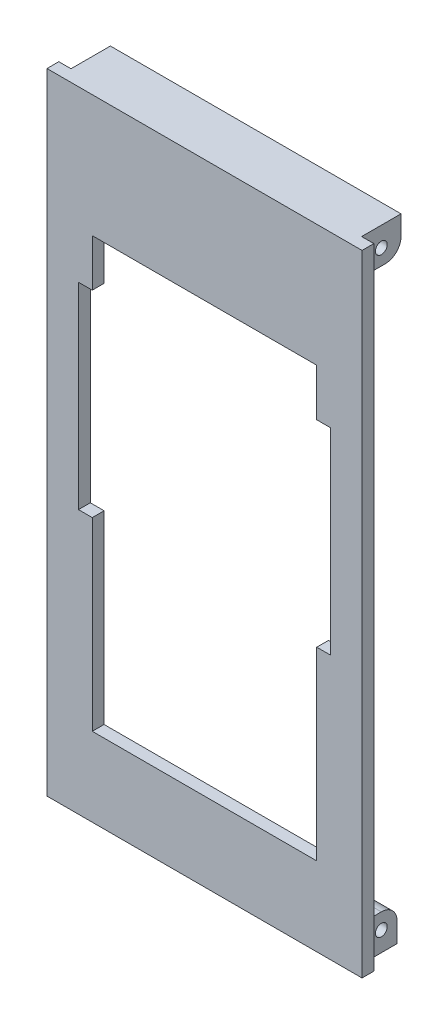
ISO-10303-21;
HEADER;
FILE_DESCRIPTION(('STEP AP214'),'2;1');
FILE_NAME('part.step','',(''),(''),'','','');
FILE_SCHEMA(('AUTOMOTIVE_DESIGN { 1 0 10303 214 1 1 1 1 }'));
ENDSEC;
DATA;
#1=APPLICATION_CONTEXT('core data for automotive mechanical design processes');
#2=APPLICATION_PROTOCOL_DEFINITION('international standard','automotive_design',2000,#1);
#3=PRODUCT_CONTEXT('',#1,'mechanical');
#4=PRODUCT('Part','Part','',(#3));
#5=PRODUCT_RELATED_PRODUCT_CATEGORY('part','',(#4));
#6=PRODUCT_DEFINITION_FORMATION('','',#4);
#7=PRODUCT_DEFINITION_CONTEXT('part definition',#1,'design');
#8=PRODUCT_DEFINITION('design','',#6,#7);
#9=PRODUCT_DEFINITION_SHAPE('','',#8);
#10=(LENGTH_UNIT() NAMED_UNIT(*) SI_UNIT(.MILLI.,.METRE.));
#11=(NAMED_UNIT(*) PLANE_ANGLE_UNIT() SI_UNIT($,.RADIAN.));
#12=(NAMED_UNIT(*) SI_UNIT($,.STERADIAN.) SOLID_ANGLE_UNIT());
#13=UNCERTAINTY_MEASURE_WITH_UNIT(LENGTH_MEASURE(1.E-05),#10,'distance_accuracy_value','');
#14=(GEOMETRIC_REPRESENTATION_CONTEXT(3) GLOBAL_UNCERTAINTY_ASSIGNED_CONTEXT((#13)) GLOBAL_UNIT_ASSIGNED_CONTEXT((#10,
#11,#12)) REPRESENTATION_CONTEXT('',''));
#15=CARTESIAN_POINT('',(0.,0.,0.));
#16=DIRECTION('',(0.,0.,1.));
#17=DIRECTION('',(1.,0.,0.));
#18=AXIS2_PLACEMENT_3D('',#15,#16,#17);
#19=CARTESIAN_POINT('',(0.,0.,0.));
#20=DIRECTION('',(1.,0.,0.));
#21=DIRECTION('',(0.,0.,-1.));
#22=AXIS2_PLACEMENT_3D('',#19,#20,#21);
#23=PLANE('',#22);
#24=DIRECTION('',(0.,1.,0.));
#25=VECTOR('',#24,1.);
#26=CARTESIAN_POINT('',(0.,9.,-3.));
#27=LINE('',#26,#25);
#28=CARTESIAN_POINT('',(0.,0.,-3.));
#29=VERTEX_POINT('',#28);
#30=CARTESIAN_POINT('',(0.,160.,-3.));
#31=VERTEX_POINT('',#30);
#32=EDGE_CURVE('E207',#29,#31,#27,.T.);
#33=ORIENTED_EDGE('',*,*,#32,.F.);
#34=DIRECTION('',(0.,0.,-1.));
#35=VECTOR('',#34,1.);
#36=CARTESIAN_POINT('',(0.,0.,0.));
#37=LINE('',#36,#35);
#38=CARTESIAN_POINT('',(0.,0.,0.));
#39=VERTEX_POINT('',#38);
#40=EDGE_CURVE('E221',#39,#29,#37,.T.);
#41=ORIENTED_EDGE('',*,*,#40,.F.);
#42=DIRECTION('',(0.,-1.,0.));
#43=VECTOR('',#42,1.);
#44=CARTESIAN_POINT('',(0.,0.,0.));
#45=LINE('',#44,#43);
#46=CARTESIAN_POINT('',(0.,160.,0.));
#47=VERTEX_POINT('',#46);
#48=EDGE_CURVE('E233',#47,#39,#45,.T.);
#49=ORIENTED_EDGE('',*,*,#48,.F.);
#50=DIRECTION('',(0.,0.,1.));
#51=VECTOR('',#50,1.);
#52=CARTESIAN_POINT('',(0.,160.,0.));
#53=LINE('',#52,#51);
#54=EDGE_CURVE('E220',#31,#47,#53,.T.);
#55=ORIENTED_EDGE('',*,*,#54,.F.);
#56=EDGE_LOOP('',(#33,#41,#49,#55));
#57=FACE_BOUND('',#56,.T.);
#58=ADVANCED_FACE('F35',(#57),#23,.F.);
#59=CARTESIAN_POINT('',(80.,0.,0.));
#60=DIRECTION('',(0.,1.,0.));
#61=DIRECTION('',(0.,0.,1.));
#62=AXIS2_PLACEMENT_3D('',#59,#60,#61);
#63=PLANE('',#62);
#64=DIRECTION('',(1.,0.,0.));
#65=VECTOR('',#64,1.);
#66=CARTESIAN_POINT('',(0.,0.,-3.));
#67=LINE('',#66,#65);
#68=CARTESIAN_POINT('',(3.1,0.,-3.));
#69=VERTEX_POINT('',#68);
#70=EDGE_CURVE('E215',#29,#69,#67,.T.);
#71=ORIENTED_EDGE('',*,*,#70,.T.);
#72=DIRECTION('',(0.,0.,1.));
#73=VECTOR('',#72,1.);
#74=CARTESIAN_POINT('',(3.1,0.,-15.));
#75=LINE('',#74,#73);
#76=CARTESIAN_POINT('',(3.1,0.,-12.));
#77=VERTEX_POINT('',#76);
#78=EDGE_CURVE('E463',#77,#69,#75,.T.);
#79=ORIENTED_EDGE('',*,*,#78,.F.);
#80=DIRECTION('',(-1.,0.,0.));
#81=VECTOR('',#80,1.);
#82=CARTESIAN_POINT('',(80.,0.,-12.));
#83=LINE('',#82,#81);
#84=CARTESIAN_POINT('',(76.9,0.,-12.));
#85=VERTEX_POINT('',#84);
#86=EDGE_CURVE('E253',#85,#77,#83,.T.);
#87=ORIENTED_EDGE('',*,*,#86,.F.);
#88=DIRECTION('',(0.,0.,1.));
#89=VECTOR('',#88,1.);
#90=CARTESIAN_POINT('',(76.9,0.,-15.));
#91=LINE('',#90,#89);
#92=CARTESIAN_POINT('',(76.9,0.,-3.));
#93=VERTEX_POINT('',#92);
#94=EDGE_CURVE('E421',#85,#93,#91,.T.);
#95=ORIENTED_EDGE('',*,*,#94,.T.);
#96=DIRECTION('',(-1.,0.,0.));
#97=VECTOR('',#96,1.);
#98=CARTESIAN_POINT('',(80.,0.,-3.));
#99=LINE('',#98,#97);
#100=CARTESIAN_POINT('',(80.,0.,-3.));
#101=VERTEX_POINT('',#100);
#102=EDGE_CURVE('E425',#101,#93,#99,.T.);
#103=ORIENTED_EDGE('',*,*,#102,.F.);
#104=DIRECTION('',(0.,0.,-1.));
#105=VECTOR('',#104,1.);
#106=CARTESIAN_POINT('',(80.,0.,0.));
#107=LINE('',#106,#105);
#108=CARTESIAN_POINT('',(80.,0.,0.));
#109=VERTEX_POINT('',#108);
#110=EDGE_CURVE('E235',#109,#101,#107,.T.);
#111=ORIENTED_EDGE('',*,*,#110,.F.);
#112=DIRECTION('',(-1.,0.,0.));
#113=VECTOR('',#112,1.);
#114=CARTESIAN_POINT('',(80.,0.,0.));
#115=LINE('',#114,#113);
#116=EDGE_CURVE('E239',#109,#39,#115,.T.);
#117=ORIENTED_EDGE('',*,*,#116,.T.);
#118=ORIENTED_EDGE('',*,*,#40,.T.);
#119=EDGE_LOOP('',(#71,#79,#87,#95,#103,#111,#117,#118));
#120=FACE_BOUND('',#119,.T.);
#121=ADVANCED_FACE('F402',(#120),#63,.F.);
#122=CARTESIAN_POINT('',(80.,0.,-12.));
#123=DIRECTION('',(0.,0.,1.));
#124=DIRECTION('',(1.,0.,0.));
#125=AXIS2_PLACEMENT_3D('',#122,#123,#124);
#126=PLANE('',#125);
#127=DIRECTION('',(0.,1.,0.));
#128=VECTOR('',#127,1.);
#129=CARTESIAN_POINT('',(3.10000000000001,0.,-12.));
#130=LINE('',#129,#128);
#131=CARTESIAN_POINT('',(3.10000000000001,5.,-12.));
#132=VERTEX_POINT('',#131);
#133=EDGE_CURVE('E290',#77,#132,#130,.T.);
#134=ORIENTED_EDGE('',*,*,#133,.T.);
#135=DIRECTION('',(-1.,0.,0.));
#136=VECTOR('',#135,1.);
#137=CARTESIAN_POINT('',(80.,5.,-12.));
#138=LINE('',#137,#136);
#139=CARTESIAN_POINT('',(76.9,5.,-12.));
#140=VERTEX_POINT('',#139);
#141=EDGE_CURVE('E43',#132,#140,#138,.F.);
#142=ORIENTED_EDGE('',*,*,#141,.T.);
#143=DIRECTION('',(0.,1.,0.));
#144=VECTOR('',#143,1.);
#145=CARTESIAN_POINT('',(76.9,0.,-12.));
#146=LINE('',#145,#144);
#147=EDGE_CURVE('E266',#85,#140,#146,.T.);
#148=ORIENTED_EDGE('',*,*,#147,.F.);
#149=ORIENTED_EDGE('',*,*,#86,.T.);
#150=EDGE_LOOP('',(#134,#142,#148,#149));
#151=FACE_BOUND('',#150,.T.);
#152=ADVANCED_FACE('F466',(#151),#126,.F.);
#153=CARTESIAN_POINT('',(80.,9.,-3.));
#154=DIRECTION('',(0.,-1.,0.));
#155=DIRECTION('',(0.,0.,-1.));
#156=AXIS2_PLACEMENT_3D('',#153,#154,#155);
#157=PLANE('',#156);
#158=DIRECTION('',(0.,0.,1.));
#159=VECTOR('',#158,1.);
#160=CARTESIAN_POINT('',(76.9,9.,-3.));
#161=LINE('',#160,#159);
#162=CARTESIAN_POINT('',(76.9,9.,-8.));
#163=VERTEX_POINT('',#162);
#164=CARTESIAN_POINT('',(76.9,9.,-3.));
#165=VERTEX_POINT('',#164);
#166=EDGE_CURVE('E285',#163,#165,#161,.T.);
#167=ORIENTED_EDGE('',*,*,#166,.F.);
#168=DIRECTION('',(-1.,0.,0.));
#169=VECTOR('',#168,1.);
#170=CARTESIAN_POINT('',(80.,9.,-8.));
#171=LINE('',#170,#169);
#172=CARTESIAN_POINT('',(3.1,9.,-8.));
#173=VERTEX_POINT('',#172);
#174=EDGE_CURVE('E275',#163,#173,#171,.T.);
#175=ORIENTED_EDGE('',*,*,#174,.T.);
#176=DIRECTION('',(0.,0.,1.));
#177=VECTOR('',#176,1.);
#178=CARTESIAN_POINT('',(3.10000000000001,9.,-2.99999999999999));
#179=LINE('',#178,#177);
#180=CARTESIAN_POINT('',(3.10000000000001,9.,-3.));
#181=VERTEX_POINT('',#180);
#182=EDGE_CURVE('E283',#173,#181,#179,.T.);
#183=ORIENTED_EDGE('',*,*,#182,.T.);
#184=DIRECTION('',(-1.,0.,0.));
#185=VECTOR('',#184,1.);
#186=CARTESIAN_POINT('',(80.,9.,-3.));
#187=LINE('',#186,#185);
#188=EDGE_CURVE('E250',#165,#181,#187,.T.);
#189=ORIENTED_EDGE('',*,*,#188,.F.);
#190=EDGE_LOOP('',(#167,#175,#183,#189));
#191=FACE_BOUND('',#190,.T.);
#192=ADVANCED_FACE('F281',(#191),#157,.F.);
#193=CARTESIAN_POINT('',(80.,151.,-3.));
#194=DIRECTION('',(0.,1.,0.));
#195=DIRECTION('',(0.,0.,1.));
#196=AXIS2_PLACEMENT_3D('',#193,#194,#195);
#197=PLANE('',#196);
#198=DIRECTION('',(0.,0.,-1.));
#199=VECTOR('',#198,1.);
#200=CARTESIAN_POINT('',(3.10000000000001,151.,-2.99999999999999));
#201=LINE('',#200,#199);
#202=CARTESIAN_POINT('',(3.1,151.,-3.));
#203=VERTEX_POINT('',#202);
#204=CARTESIAN_POINT('',(3.1,151.,-9.));
#205=VERTEX_POINT('',#204);
#206=EDGE_CURVE('E291',#203,#205,#201,.T.);
#207=ORIENTED_EDGE('',*,*,#206,.T.);
#208=DIRECTION('',(-1.,0.,0.));
#209=VECTOR('',#208,1.);
#210=CARTESIAN_POINT('',(80.,151.,-9.));
#211=LINE('',#210,#209);
#212=CARTESIAN_POINT('',(76.9,151.,-9.));
#213=VERTEX_POINT('',#212);
#214=EDGE_CURVE('E271',#205,#213,#211,.F.);
#215=ORIENTED_EDGE('',*,*,#214,.T.);
#216=DIRECTION('',(0.,0.,-1.));
#217=VECTOR('',#216,1.);
#218=CARTESIAN_POINT('',(76.9,151.,-3.));
#219=LINE('',#218,#217);
#220=CARTESIAN_POINT('',(76.9,151.,-3.));
#221=VERTEX_POINT('',#220);
#222=EDGE_CURVE('E434',#221,#213,#219,.T.);
#223=ORIENTED_EDGE('',*,*,#222,.F.);
#224=DIRECTION('',(-1.,0.,0.));
#225=VECTOR('',#224,1.);
#226=CARTESIAN_POINT('',(80.,151.,-3.));
#227=LINE('',#226,#225);
#228=EDGE_CURVE('E247',#221,#203,#227,.T.);
#229=ORIENTED_EDGE('',*,*,#228,.T.);
#230=EDGE_LOOP('',(#207,#215,#223,#229));
#231=FACE_BOUND('',#230,.T.);
#232=ADVANCED_FACE('F457',(#231),#197,.F.);
#233=CARTESIAN_POINT('',(80.,160.,-13.));
#234=DIRECTION('',(0.,0.,1.));
#235=DIRECTION('',(0.,-1.,0.));
#236=AXIS2_PLACEMENT_3D('',#233,#234,#235);
#237=PLANE('',#236);
#238=DIRECTION('',(0.,1.,0.));
#239=VECTOR('',#238,1.);
#240=CARTESIAN_POINT('',(76.9,160.,-13.));
#241=LINE('',#240,#239);
#242=CARTESIAN_POINT('',(76.9,155.,-13.));
#243=VERTEX_POINT('',#242);
#244=CARTESIAN_POINT('',(76.9,160.,-13.));
#245=VERTEX_POINT('',#244);
#246=EDGE_CURVE('E432',#243,#245,#241,.T.);
#247=ORIENTED_EDGE('',*,*,#246,.F.);
#248=DIRECTION('',(-1.,0.,0.));
#249=VECTOR('',#248,1.);
#250=CARTESIAN_POINT('',(80.,155.,-13.));
#251=LINE('',#250,#249);
#252=CARTESIAN_POINT('',(3.10000000000001,155.,-13.));
#253=VERTEX_POINT('',#252);
#254=EDGE_CURVE('E256',#243,#253,#251,.T.);
#255=ORIENTED_EDGE('',*,*,#254,.T.);
#256=DIRECTION('',(0.,1.,0.));
#257=VECTOR('',#256,1.);
#258=CARTESIAN_POINT('',(3.10000000000001,160.,-13.));
#259=LINE('',#258,#257);
#260=CARTESIAN_POINT('',(3.1,160.,-13.));
#261=VERTEX_POINT('',#260);
#262=EDGE_CURVE('E296',#253,#261,#259,.T.);
#263=ORIENTED_EDGE('',*,*,#262,.T.);
#264=DIRECTION('',(-1.,0.,0.));
#265=VECTOR('',#264,1.);
#266=CARTESIAN_POINT('',(80.,160.,-13.));
#267=LINE('',#266,#265);
#268=EDGE_CURVE('E245',#245,#261,#267,.T.);
#269=ORIENTED_EDGE('',*,*,#268,.F.);
#270=EDGE_LOOP('',(#247,#255,#263,#269));
#271=FACE_BOUND('',#270,.T.);
#272=ADVANCED_FACE('F444',(#271),#237,.F.);
#273=CARTESIAN_POINT('',(80.,160.,0.));
#274=DIRECTION('',(0.,-1.,0.));
#275=DIRECTION('',(0.,0.,-1.));
#276=AXIS2_PLACEMENT_3D('',#273,#274,#275);
#277=PLANE('',#276);
#278=DIRECTION('',(1.,0.,0.));
#279=VECTOR('',#278,1.);
#280=CARTESIAN_POINT('',(0.,160.,-3.));
#281=LINE('',#280,#279);
#282=CARTESIAN_POINT('',(3.1,160.,-3.));
#283=VERTEX_POINT('',#282);
#284=EDGE_CURVE('E212',#31,#283,#281,.T.);
#285=ORIENTED_EDGE('',*,*,#284,.F.);
#286=ORIENTED_EDGE('',*,*,#54,.T.);
#287=DIRECTION('',(-1.,0.,0.));
#288=VECTOR('',#287,1.);
#289=CARTESIAN_POINT('',(80.,160.,0.));
#290=LINE('',#289,#288);
#291=CARTESIAN_POINT('',(80.,160.,0.));
#292=VERTEX_POINT('',#291);
#293=EDGE_CURVE('E242',#292,#47,#290,.T.);
#294=ORIENTED_EDGE('',*,*,#293,.F.);
#295=DIRECTION('',(0.,0.,1.));
#296=VECTOR('',#295,1.);
#297=CARTESIAN_POINT('',(80.,160.,0.));
#298=LINE('',#297,#296);
#299=CARTESIAN_POINT('',(80.,160.,-3.));
#300=VERTEX_POINT('',#299);
#301=EDGE_CURVE('E399',#300,#292,#298,.T.);
#302=ORIENTED_EDGE('',*,*,#301,.F.);
#303=DIRECTION('',(-1.,0.,0.));
#304=VECTOR('',#303,1.);
#305=CARTESIAN_POINT('',(80.,160.,-3.));
#306=LINE('',#305,#304);
#307=CARTESIAN_POINT('',(76.9,160.,-3.));
#308=VERTEX_POINT('',#307);
#309=EDGE_CURVE('E414',#300,#308,#306,.T.);
#310=ORIENTED_EDGE('',*,*,#309,.T.);
#311=DIRECTION('',(0.,0.,1.));
#312=VECTOR('',#311,1.);
#313=CARTESIAN_POINT('',(76.9,160.,-15.));
#314=LINE('',#313,#312);
#315=EDGE_CURVE('E422',#245,#308,#314,.T.);
#316=ORIENTED_EDGE('',*,*,#315,.F.);
#317=ORIENTED_EDGE('',*,*,#268,.T.);
#318=DIRECTION('',(0.,0.,1.));
#319=VECTOR('',#318,1.);
#320=CARTESIAN_POINT('',(3.1,160.,-15.));
#321=LINE('',#320,#319);
#322=EDGE_CURVE('E229',#261,#283,#321,.T.);
#323=ORIENTED_EDGE('',*,*,#322,.T.);
#324=EDGE_LOOP('',(#285,#286,#294,#302,#310,#316,#317,#323));
#325=FACE_BOUND('',#324,.T.);
#326=ADVANCED_FACE('F224',(#325),#277,.F.);
#327=CARTESIAN_POINT('',(80.,0.,0.));
#328=DIRECTION('',(1.,0.,0.));
#329=DIRECTION('',(0.,0.,-1.));
#330=AXIS2_PLACEMENT_3D('',#327,#328,#329);
#331=PLANE('',#330);
#332=DIRECTION('',(0.,1.,0.));
#333=VECTOR('',#332,1.);
#334=CARTESIAN_POINT('',(80.,9.,-3.));
#335=LINE('',#334,#333);
#336=EDGE_CURVE('E397',#101,#300,#335,.T.);
#337=ORIENTED_EDGE('',*,*,#336,.T.);
#338=ORIENTED_EDGE('',*,*,#301,.T.);
#339=DIRECTION('',(0.,-1.,0.));
#340=VECTOR('',#339,1.);
#341=CARTESIAN_POINT('',(80.,0.,0.));
#342=LINE('',#341,#340);
#343=EDGE_CURVE('E243',#292,#109,#342,.T.);
#344=ORIENTED_EDGE('',*,*,#343,.T.);
#345=ORIENTED_EDGE('',*,*,#110,.T.);
#346=EDGE_LOOP('',(#337,#338,#344,#345));
#347=FACE_BOUND('',#346,.T.);
#348=ADVANCED_FACE('F416',(#347),#331,.T.);
#349=CARTESIAN_POINT('',(80.,9.,-3.));
#350=DIRECTION('',(0.,0.,1.));
#351=DIRECTION('',(1.,0.,0.));
#352=AXIS2_PLACEMENT_3D('',#349,#350,#351);
#353=PLANE('',#352);
#354=ORIENTED_EDGE('',*,*,#336,.F.);
#355=ORIENTED_EDGE('',*,*,#102,.T.);
#356=DIRECTION('',(0.,-1.,0.));
#357=VECTOR('',#356,1.);
#358=CARTESIAN_POINT('',(76.9,160.,-3.));
#359=LINE('',#358,#357);
#360=EDGE_CURVE('E462',#165,#93,#359,.T.);
#361=ORIENTED_EDGE('',*,*,#360,.F.);
#362=ORIENTED_EDGE('',*,*,#188,.T.);
#363=DIRECTION('',(0.,-1.,0.));
#364=VECTOR('',#363,1.);
#365=CARTESIAN_POINT('',(3.1,160.,-3.));
#366=LINE('',#365,#364);
#367=EDGE_CURVE('E230',#181,#69,#366,.T.);
#368=ORIENTED_EDGE('',*,*,#367,.T.);
#369=ORIENTED_EDGE('',*,*,#70,.F.);
#370=ORIENTED_EDGE('',*,*,#32,.T.);
#371=ORIENTED_EDGE('',*,*,#284,.T.);
#372=EDGE_CURVE('E261',#283,#203,#366,.T.);
#373=ORIENTED_EDGE('',*,*,#372,.T.);
#374=ORIENTED_EDGE('',*,*,#228,.F.);
#375=EDGE_CURVE('E419',#308,#221,#359,.T.);
#376=ORIENTED_EDGE('',*,*,#375,.F.);
#377=ORIENTED_EDGE('',*,*,#309,.F.);
#378=EDGE_LOOP('',(#354,#355,#361,#362,#368,#369,#370,#371,#373,#374,#376,#377));
#379=FACE_BOUND('',#378,.T.);
#380=DIRECTION('',(-1.,0.,0.));
#381=VECTOR('',#380,1.);
#382=CARTESIAN_POINT('',(80.,117.,-3.));
#383=LINE('',#382,#381);
#384=CARTESIAN_POINT('',(72.,117.,-3.));
#385=VERTEX_POINT('',#384);
#386=CARTESIAN_POINT('',(68.5,117.,-3.));
#387=VERTEX_POINT('',#386);
#388=EDGE_CURVE('E389',#385,#387,#383,.T.);
#389=ORIENTED_EDGE('',*,*,#388,.T.);
#390=DIRECTION('',(0.,1.,0.));
#391=VECTOR('',#390,1.);
#392=CARTESIAN_POINT('',(68.4999999999999,9.00000000000001,-3.));
#393=LINE('',#392,#391);
#394=CARTESIAN_POINT('',(68.5,129.,-3.));
#395=VERTEX_POINT('',#394);
#396=EDGE_CURVE('E392',#387,#395,#393,.T.);
#397=ORIENTED_EDGE('',*,*,#396,.T.);
#398=DIRECTION('',(-1.,0.,0.));
#399=VECTOR('',#398,1.);
#400=CARTESIAN_POINT('',(80.,129.,-3.));
#401=LINE('',#400,#399);
#402=CARTESIAN_POINT('',(11.5,129.,-3.));
#403=VERTEX_POINT('',#402);
#404=EDGE_CURVE('E337',#395,#403,#401,.T.);
#405=ORIENTED_EDGE('',*,*,#404,.T.);
#406=DIRECTION('',(0.,-1.,0.));
#407=VECTOR('',#406,1.);
#408=CARTESIAN_POINT('',(11.5,9.,-3.));
#409=LINE('',#408,#407);
#410=CARTESIAN_POINT('',(11.5,117.,-3.));
#411=VERTEX_POINT('',#410);
#412=EDGE_CURVE('E362',#403,#411,#409,.T.);
#413=ORIENTED_EDGE('',*,*,#412,.T.);
#414=DIRECTION('',(-1.,0.,0.));
#415=VECTOR('',#414,1.);
#416=CARTESIAN_POINT('',(80.,117.,-3.));
#417=LINE('',#416,#415);
#418=CARTESIAN_POINT('',(8.,117.,-3.));
#419=VERTEX_POINT('',#418);
#420=EDGE_CURVE('E365',#411,#419,#417,.T.);
#421=ORIENTED_EDGE('',*,*,#420,.T.);
#422=DIRECTION('',(0.,-1.,0.));
#423=VECTOR('',#422,1.);
#424=CARTESIAN_POINT('',(8.00000000000001,9.,-3.));
#425=LINE('',#424,#423);
#426=CARTESIAN_POINT('',(8.,67.,-3.));
#427=VERTEX_POINT('',#426);
#428=EDGE_CURVE('E368',#419,#427,#425,.T.);
#429=ORIENTED_EDGE('',*,*,#428,.T.);
#430=DIRECTION('',(1.,0.,0.));
#431=VECTOR('',#430,1.);
#432=CARTESIAN_POINT('',(80.,67.,-3.));
#433=LINE('',#432,#431);
#434=CARTESIAN_POINT('',(11.5,67.,-3.));
#435=VERTEX_POINT('',#434);
#436=EDGE_CURVE('E371',#427,#435,#433,.T.);
#437=ORIENTED_EDGE('',*,*,#436,.T.);
#438=DIRECTION('',(0.,-1.,0.));
#439=VECTOR('',#438,1.);
#440=CARTESIAN_POINT('',(11.5,9.00000000000001,-3.));
#441=LINE('',#440,#439);
#442=CARTESIAN_POINT('',(11.5,20.,-3.));
#443=VERTEX_POINT('',#442);
#444=EDGE_CURVE('E374',#435,#443,#441,.T.);
#445=ORIENTED_EDGE('',*,*,#444,.T.);
#446=DIRECTION('',(1.,0.,0.));
#447=VECTOR('',#446,1.);
#448=CARTESIAN_POINT('',(80.,20.,-3.));
#449=LINE('',#448,#447);
#450=CARTESIAN_POINT('',(68.5,20.,-3.));
#451=VERTEX_POINT('',#450);
#452=EDGE_CURVE('E377',#443,#451,#449,.T.);
#453=ORIENTED_EDGE('',*,*,#452,.T.);
#454=DIRECTION('',(0.,1.,0.));
#455=VECTOR('',#454,1.);
#456=CARTESIAN_POINT('',(68.5,9.,-3.));
#457=LINE('',#456,#455);
#458=CARTESIAN_POINT('',(68.5,67.,-3.));
#459=VERTEX_POINT('',#458);
#460=EDGE_CURVE('E380',#451,#459,#457,.T.);
#461=ORIENTED_EDGE('',*,*,#460,.T.);
#462=DIRECTION('',(1.,0.,0.));
#463=VECTOR('',#462,1.);
#464=CARTESIAN_POINT('',(80.,67.,-3.));
#465=LINE('',#464,#463);
#466=CARTESIAN_POINT('',(72.,67.,-3.));
#467=VERTEX_POINT('',#466);
#468=EDGE_CURVE('E383',#459,#467,#465,.T.);
#469=ORIENTED_EDGE('',*,*,#468,.T.);
#470=DIRECTION('',(0.,1.,0.));
#471=VECTOR('',#470,1.);
#472=CARTESIAN_POINT('',(72.,9.,-3.));
#473=LINE('',#472,#471);
#474=EDGE_CURVE('E386',#467,#385,#473,.T.);
#475=ORIENTED_EDGE('',*,*,#474,.T.);
#476=EDGE_LOOP('',(#389,#397,#405,#413,#421,#429,#437,#445,#453,#461,#469,#475));
#477=FACE_BOUND('',#476,.T.);
#478=ADVANCED_FACE('F209',(#379,#477),#353,.F.);
#479=CARTESIAN_POINT('',(80.,0.,0.));
#480=DIRECTION('',(0.,0.,-1.));
#481=DIRECTION('',(-1.,0.,0.));
#482=AXIS2_PLACEMENT_3D('',#479,#480,#481);
#483=PLANE('',#482);
#484=DIRECTION('',(-1.,0.,0.));
#485=VECTOR('',#484,1.);
#486=CARTESIAN_POINT('',(11.5,129.,0.));
#487=LINE('',#486,#485);
#488=CARTESIAN_POINT('',(68.5,129.,0.));
#489=VERTEX_POINT('',#488);
#490=CARTESIAN_POINT('',(11.5,129.,0.));
#491=VERTEX_POINT('',#490);
#492=EDGE_CURVE('E301',#489,#491,#487,.T.);
#493=ORIENTED_EDGE('',*,*,#492,.F.);
#494=DIRECTION('',(0.,1.,0.));
#495=VECTOR('',#494,1.);
#496=CARTESIAN_POINT('',(68.5,117.,0.));
#497=LINE('',#496,#495);
#498=CARTESIAN_POINT('',(68.5,117.,0.));
#499=VERTEX_POINT('',#498);
#500=EDGE_CURVE('E293',#499,#489,#497,.T.);
#501=ORIENTED_EDGE('',*,*,#500,.F.);
#502=DIRECTION('',(-1.,0.,0.));
#503=VECTOR('',#502,1.);
#504=CARTESIAN_POINT('',(68.5,117.,0.));
#505=LINE('',#504,#503);
#506=CARTESIAN_POINT('',(72.,117.,0.));
#507=VERTEX_POINT('',#506);
#508=EDGE_CURVE('E331',#507,#499,#505,.T.);
#509=ORIENTED_EDGE('',*,*,#508,.F.);
#510=DIRECTION('',(0.,1.,0.));
#511=VECTOR('',#510,1.);
#512=CARTESIAN_POINT('',(72.,67.,0.));
#513=LINE('',#512,#511);
#514=CARTESIAN_POINT('',(72.,67.,0.));
#515=VERTEX_POINT('',#514);
#516=EDGE_CURVE('E328',#515,#507,#513,.T.);
#517=ORIENTED_EDGE('',*,*,#516,.F.);
#518=DIRECTION('',(1.,0.,0.));
#519=VECTOR('',#518,1.);
#520=CARTESIAN_POINT('',(68.5,67.,0.));
#521=LINE('',#520,#519);
#522=CARTESIAN_POINT('',(68.5,67.,0.));
#523=VERTEX_POINT('',#522);
#524=EDGE_CURVE('E325',#523,#515,#521,.T.);
#525=ORIENTED_EDGE('',*,*,#524,.F.);
#526=DIRECTION('',(0.,1.,0.));
#527=VECTOR('',#526,1.);
#528=CARTESIAN_POINT('',(68.5,20.,0.));
#529=LINE('',#528,#527);
#530=CARTESIAN_POINT('',(68.5,20.,0.));
#531=VERTEX_POINT('',#530);
#532=EDGE_CURVE('E322',#531,#523,#529,.T.);
#533=ORIENTED_EDGE('',*,*,#532,.F.);
#534=DIRECTION('',(1.,0.,0.));
#535=VECTOR('',#534,1.);
#536=CARTESIAN_POINT('',(11.5,20.,0.));
#537=LINE('',#536,#535);
#538=CARTESIAN_POINT('',(11.5,20.,0.));
#539=VERTEX_POINT('',#538);
#540=EDGE_CURVE('E319',#539,#531,#537,.T.);
#541=ORIENTED_EDGE('',*,*,#540,.F.);
#542=DIRECTION('',(0.,-1.,0.));
#543=VECTOR('',#542,1.);
#544=CARTESIAN_POINT('',(11.5,20.,0.));
#545=LINE('',#544,#543);
#546=CARTESIAN_POINT('',(11.5,67.,0.));
#547=VERTEX_POINT('',#546);
#548=EDGE_CURVE('E316',#547,#539,#545,.T.);
#549=ORIENTED_EDGE('',*,*,#548,.F.);
#550=DIRECTION('',(1.,0.,0.));
#551=VECTOR('',#550,1.);
#552=CARTESIAN_POINT('',(8.,67.,0.));
#553=LINE('',#552,#551);
#554=CARTESIAN_POINT('',(8.,67.,0.));
#555=VERTEX_POINT('',#554);
#556=EDGE_CURVE('E313',#555,#547,#553,.T.);
#557=ORIENTED_EDGE('',*,*,#556,.F.);
#558=DIRECTION('',(0.,-1.,0.));
#559=VECTOR('',#558,1.);
#560=CARTESIAN_POINT('',(8.,67.,0.));
#561=LINE('',#560,#559);
#562=CARTESIAN_POINT('',(8.,117.,0.));
#563=VERTEX_POINT('',#562);
#564=EDGE_CURVE('E310',#563,#555,#561,.T.);
#565=ORIENTED_EDGE('',*,*,#564,.F.);
#566=DIRECTION('',(-1.,0.,0.));
#567=VECTOR('',#566,1.);
#568=CARTESIAN_POINT('',(8.,117.,0.));
#569=LINE('',#568,#567);
#570=CARTESIAN_POINT('',(11.5,117.,0.));
#571=VERTEX_POINT('',#570);
#572=EDGE_CURVE('E307',#571,#563,#569,.T.);
#573=ORIENTED_EDGE('',*,*,#572,.F.);
#574=DIRECTION('',(0.,-1.,0.));
#575=VECTOR('',#574,1.);
#576=CARTESIAN_POINT('',(11.5,117.,0.));
#577=LINE('',#576,#575);
#578=EDGE_CURVE('E304',#491,#571,#577,.T.);
#579=ORIENTED_EDGE('',*,*,#578,.F.);
#580=EDGE_LOOP('',(#493,#501,#509,#517,#525,#533,#541,#549,#557,#565,#573,#579));
#581=FACE_BOUND('',#580,.T.);
#582=ORIENTED_EDGE('',*,*,#48,.T.);
#583=ORIENTED_EDGE('',*,*,#116,.F.);
#584=ORIENTED_EDGE('',*,*,#343,.F.);
#585=ORIENTED_EDGE('',*,*,#293,.T.);
#586=EDGE_LOOP('',(#582,#583,#584,#585));
#587=FACE_BOUND('',#586,.T.);
#588=ADVANCED_FACE('F409',(#581,#587),#483,.F.);
#589=CARTESIAN_POINT('',(68.5,117.,-13.));
#590=DIRECTION('',(1.,0.,0.));
#591=DIRECTION('',(0.,1.,0.));
#592=AXIS2_PLACEMENT_3D('',#589,#590,#591);
#593=PLANE('',#592);
#594=DIRECTION('',(0.,0.,1.));
#595=VECTOR('',#594,1.);
#596=CARTESIAN_POINT('',(68.5,117.,-13.));
#597=LINE('',#596,#595);
#598=EDGE_CURVE('E335',#387,#499,#597,.T.);
#599=ORIENTED_EDGE('',*,*,#598,.T.);
#600=ORIENTED_EDGE('',*,*,#500,.T.);
#601=DIRECTION('',(0.,0.,1.));
#602=VECTOR('',#601,1.);
#603=CARTESIAN_POINT('',(68.5,129.,-13.));
#604=LINE('',#603,#602);
#605=EDGE_CURVE('E334',#395,#489,#604,.T.);
#606=ORIENTED_EDGE('',*,*,#605,.F.);
#607=ORIENTED_EDGE('',*,*,#396,.F.);
#608=EDGE_LOOP('',(#599,#600,#606,#607));
#609=FACE_BOUND('',#608,.T.);
#610=ADVANCED_FACE('F485',(#609),#593,.F.);
#611=CARTESIAN_POINT('',(68.5,117.,-13.));
#612=DIRECTION('',(0.,1.,0.));
#613=DIRECTION('',(0.,0.,1.));
#614=AXIS2_PLACEMENT_3D('',#611,#612,#613);
#615=PLANE('',#614);
#616=DIRECTION('',(0.,0.,1.));
#617=VECTOR('',#616,1.);
#618=CARTESIAN_POINT('',(72.,117.,-13.));
#619=LINE('',#618,#617);
#620=EDGE_CURVE('E338',#385,#507,#619,.T.);
#621=ORIENTED_EDGE('',*,*,#620,.T.);
#622=ORIENTED_EDGE('',*,*,#508,.T.);
#623=ORIENTED_EDGE('',*,*,#598,.F.);
#624=ORIENTED_EDGE('',*,*,#388,.F.);
#625=EDGE_LOOP('',(#621,#622,#623,#624));
#626=FACE_BOUND('',#625,.T.);
#627=ADVANCED_FACE('F540',(#626),#615,.F.);
#628=CARTESIAN_POINT('',(72.,67.,-13.));
#629=DIRECTION('',(1.,0.,0.));
#630=DIRECTION('',(0.,0.,-1.));
#631=AXIS2_PLACEMENT_3D('',#628,#629,#630);
#632=PLANE('',#631);
#633=DIRECTION('',(0.,0.,1.));
#634=VECTOR('',#633,1.);
#635=CARTESIAN_POINT('',(72.,67.,-13.));
#636=LINE('',#635,#634);
#637=EDGE_CURVE('E340',#467,#515,#636,.T.);
#638=ORIENTED_EDGE('',*,*,#637,.T.);
#639=ORIENTED_EDGE('',*,*,#516,.T.);
#640=ORIENTED_EDGE('',*,*,#620,.F.);
#641=ORIENTED_EDGE('',*,*,#474,.F.);
#642=EDGE_LOOP('',(#638,#639,#640,#641));
#643=FACE_BOUND('',#642,.T.);
#644=ADVANCED_FACE('F548',(#643),#632,.F.);
#645=CARTESIAN_POINT('',(68.5,67.,-13.));
#646=DIRECTION('',(0.,-1.,0.));
#647=DIRECTION('',(0.,0.,-1.));
#648=AXIS2_PLACEMENT_3D('',#645,#646,#647);
#649=PLANE('',#648);
#650=DIRECTION('',(0.,0.,1.));
#651=VECTOR('',#650,1.);
#652=CARTESIAN_POINT('',(68.5,67.,-13.));
#653=LINE('',#652,#651);
#654=EDGE_CURVE('E342',#459,#523,#653,.T.);
#655=ORIENTED_EDGE('',*,*,#654,.T.);
#656=ORIENTED_EDGE('',*,*,#524,.T.);
#657=ORIENTED_EDGE('',*,*,#637,.F.);
#658=ORIENTED_EDGE('',*,*,#468,.F.);
#659=EDGE_LOOP('',(#655,#656,#657,#658));
#660=FACE_BOUND('',#659,.T.);
#661=ADVANCED_FACE('F556',(#660),#649,.F.);
#662=CARTESIAN_POINT('',(68.5,20.,-13.));
#663=DIRECTION('',(1.,0.,0.));
#664=DIRECTION('',(0.,0.,-1.));
#665=AXIS2_PLACEMENT_3D('',#662,#663,#664);
#666=PLANE('',#665);
#667=DIRECTION('',(0.,0.,1.));
#668=VECTOR('',#667,1.);
#669=CARTESIAN_POINT('',(68.5,20.,-13.));
#670=LINE('',#669,#668);
#671=EDGE_CURVE('E344',#451,#531,#670,.T.);
#672=ORIENTED_EDGE('',*,*,#671,.T.);
#673=ORIENTED_EDGE('',*,*,#532,.T.);
#674=ORIENTED_EDGE('',*,*,#654,.F.);
#675=ORIENTED_EDGE('',*,*,#460,.F.);
#676=EDGE_LOOP('',(#672,#673,#674,#675));
#677=FACE_BOUND('',#676,.T.);
#678=ADVANCED_FACE('F564',(#677),#666,.F.);
#679=CARTESIAN_POINT('',(11.5,20.,-13.));
#680=DIRECTION('',(0.,-1.,0.));
#681=DIRECTION('',(1.,0.,0.));
#682=AXIS2_PLACEMENT_3D('',#679,#680,#681);
#683=PLANE('',#682);
#684=DIRECTION('',(0.,0.,1.));
#685=VECTOR('',#684,1.);
#686=CARTESIAN_POINT('',(11.5,20.,-13.));
#687=LINE('',#686,#685);
#688=EDGE_CURVE('E346',#443,#539,#687,.T.);
#689=ORIENTED_EDGE('',*,*,#688,.T.);
#690=ORIENTED_EDGE('',*,*,#540,.T.);
#691=ORIENTED_EDGE('',*,*,#671,.F.);
#692=ORIENTED_EDGE('',*,*,#452,.F.);
#693=EDGE_LOOP('',(#689,#690,#691,#692));
#694=FACE_BOUND('',#693,.T.);
#695=ADVANCED_FACE('F572',(#694),#683,.F.);
#696=CARTESIAN_POINT('',(11.5,20.,-13.));
#697=DIRECTION('',(-1.,0.,0.));
#698=DIRECTION('',(0.,-1.,0.));
#699=AXIS2_PLACEMENT_3D('',#696,#697,#698);
#700=PLANE('',#699);
#701=DIRECTION('',(0.,0.,1.));
#702=VECTOR('',#701,1.);
#703=CARTESIAN_POINT('',(11.5,67.,-13.));
#704=LINE('',#703,#702);
#705=EDGE_CURVE('E348',#435,#547,#704,.T.);
#706=ORIENTED_EDGE('',*,*,#705,.T.);
#707=ORIENTED_EDGE('',*,*,#548,.T.);
#708=ORIENTED_EDGE('',*,*,#688,.F.);
#709=ORIENTED_EDGE('',*,*,#444,.F.);
#710=EDGE_LOOP('',(#706,#707,#708,#709));
#711=FACE_BOUND('',#710,.T.);
#712=ADVANCED_FACE('F580',(#711),#700,.F.);
#713=CARTESIAN_POINT('',(8.,67.,-13.));
#714=DIRECTION('',(0.,-1.,0.));
#715=DIRECTION('',(0.,0.,-1.));
#716=AXIS2_PLACEMENT_3D('',#713,#714,#715);
#717=PLANE('',#716);
#718=DIRECTION('',(0.,0.,1.));
#719=VECTOR('',#718,1.);
#720=CARTESIAN_POINT('',(8.,67.,-13.));
#721=LINE('',#720,#719);
#722=EDGE_CURVE('E350',#427,#555,#721,.T.);
#723=ORIENTED_EDGE('',*,*,#722,.T.);
#724=ORIENTED_EDGE('',*,*,#556,.T.);
#725=ORIENTED_EDGE('',*,*,#705,.F.);
#726=ORIENTED_EDGE('',*,*,#436,.F.);
#727=EDGE_LOOP('',(#723,#724,#725,#726));
#728=FACE_BOUND('',#727,.T.);
#729=ADVANCED_FACE('F588',(#728),#717,.F.);
#730=CARTESIAN_POINT('',(8.,67.,-13.));
#731=DIRECTION('',(-1.,0.,0.));
#732=DIRECTION('',(0.,0.,1.));
#733=AXIS2_PLACEMENT_3D('',#730,#731,#732);
#734=PLANE('',#733);
#735=DIRECTION('',(0.,0.,1.));
#736=VECTOR('',#735,1.);
#737=CARTESIAN_POINT('',(8.,117.,-13.));
#738=LINE('',#737,#736);
#739=EDGE_CURVE('E352',#419,#563,#738,.T.);
#740=ORIENTED_EDGE('',*,*,#739,.T.);
#741=ORIENTED_EDGE('',*,*,#564,.T.);
#742=ORIENTED_EDGE('',*,*,#722,.F.);
#743=ORIENTED_EDGE('',*,*,#428,.F.);
#744=EDGE_LOOP('',(#740,#741,#742,#743));
#745=FACE_BOUND('',#744,.T.);
#746=ADVANCED_FACE('F596',(#745),#734,.F.);
#747=CARTESIAN_POINT('',(8.,117.,-13.));
#748=DIRECTION('',(0.,1.,0.));
#749=DIRECTION('',(0.,0.,1.));
#750=AXIS2_PLACEMENT_3D('',#747,#748,#749);
#751=PLANE('',#750);
#752=DIRECTION('',(0.,0.,1.));
#753=VECTOR('',#752,1.);
#754=CARTESIAN_POINT('',(11.5,117.,-13.));
#755=LINE('',#754,#753);
#756=EDGE_CURVE('E354',#411,#571,#755,.T.);
#757=ORIENTED_EDGE('',*,*,#756,.T.);
#758=ORIENTED_EDGE('',*,*,#572,.T.);
#759=ORIENTED_EDGE('',*,*,#739,.F.);
#760=ORIENTED_EDGE('',*,*,#420,.F.);
#761=EDGE_LOOP('',(#757,#758,#759,#760));
#762=FACE_BOUND('',#761,.T.);
#763=ADVANCED_FACE('F604',(#762),#751,.F.);
#764=CARTESIAN_POINT('',(11.5,117.,-13.));
#765=DIRECTION('',(-1.,0.,0.));
#766=DIRECTION('',(0.,0.,1.));
#767=AXIS2_PLACEMENT_3D('',#764,#765,#766);
#768=PLANE('',#767);
#769=DIRECTION('',(0.,0.,1.));
#770=VECTOR('',#769,1.);
#771=CARTESIAN_POINT('',(11.5,129.,-13.));
#772=LINE('',#771,#770);
#773=EDGE_CURVE('E356',#403,#491,#772,.T.);
#774=ORIENTED_EDGE('',*,*,#773,.T.);
#775=ORIENTED_EDGE('',*,*,#578,.T.);
#776=ORIENTED_EDGE('',*,*,#756,.F.);
#777=ORIENTED_EDGE('',*,*,#412,.F.);
#778=EDGE_LOOP('',(#774,#775,#776,#777));
#779=FACE_BOUND('',#778,.T.);
#780=ADVANCED_FACE('F612',(#779),#768,.F.);
#781=CARTESIAN_POINT('',(11.5,129.,-13.));
#782=DIRECTION('',(0.,1.,0.));
#783=DIRECTION('',(0.,0.,1.));
#784=AXIS2_PLACEMENT_3D('',#781,#782,#783);
#785=PLANE('',#784);
#786=ORIENTED_EDGE('',*,*,#605,.T.);
#787=ORIENTED_EDGE('',*,*,#492,.T.);
#788=ORIENTED_EDGE('',*,*,#773,.F.);
#789=ORIENTED_EDGE('',*,*,#404,.F.);
#790=EDGE_LOOP('',(#786,#787,#788,#789));
#791=FACE_BOUND('',#790,.T.);
#792=ADVANCED_FACE('F620',(#791),#785,.F.);
#793=CARTESIAN_POINT('',(76.9,160.,-15.));
#794=DIRECTION('',(1.,0.,0.));
#795=DIRECTION('',(0.,0.,-1.));
#796=AXIS2_PLACEMENT_3D('',#793,#794,#795);
#797=PLANE('',#796);
#798=CARTESIAN_POINT('',(76.9,5.,-8.));
#799=DIRECTION('',(1.,0.,0.));
#800=DIRECTION('',(0.,0.,-1.));
#801=AXIS2_PLACEMENT_3D('',#798,#799,#800);
#802=CIRCLE('',#801,1.5);
#803=CARTESIAN_POINT('',(76.9,5.,-9.5));
#804=VERTEX_POINT('',#803);
#805=EDGE_CURVE('E257',#804,#804,#802,.T.);
#806=ORIENTED_EDGE('',*,*,#805,.F.);
#807=EDGE_LOOP('',(#806));
#808=FACE_BOUND('',#807,.T.);
#809=ORIENTED_EDGE('',*,*,#147,.T.);
#810=CARTESIAN_POINT('',(76.9,5.,-8.));
#811=DIRECTION('',(1.,0.,0.));
#812=DIRECTION('',(0.,0.,-1.));
#813=AXIS2_PLACEMENT_3D('',#810,#811,#812);
#814=CIRCLE('',#813,4.);
#815=EDGE_CURVE('E11',#140,#163,#814,.T.);
#816=ORIENTED_EDGE('',*,*,#815,.T.);
#817=ORIENTED_EDGE('',*,*,#166,.T.);
#818=ORIENTED_EDGE('',*,*,#360,.T.);
#819=ORIENTED_EDGE('',*,*,#94,.F.);
#820=EDGE_LOOP('',(#809,#816,#817,#818,#819));
#821=FACE_BOUND('',#820,.T.);
#822=ADVANCED_FACE('F468',(#808,#821),#797,.T.);
#823=CARTESIAN_POINT('',(3.1,160.,-15.));
#824=DIRECTION('',(1.,0.,0.));
#825=DIRECTION('',(0.,0.,-1.));
#826=AXIS2_PLACEMENT_3D('',#823,#824,#825);
#827=PLANE('',#826);
#828=CARTESIAN_POINT('',(3.10000000000001,5.,-8.));
#829=DIRECTION('',(1.,0.,0.));
#830=DIRECTION('',(0.,0.,-1.));
#831=AXIS2_PLACEMENT_3D('',#828,#829,#830);
#832=CIRCLE('',#831,1.5);
#833=CARTESIAN_POINT('',(3.10000000000001,5.,-9.5));
#834=VERTEX_POINT('',#833);
#835=EDGE_CURVE('E262',#834,#834,#832,.T.);
#836=ORIENTED_EDGE('',*,*,#835,.T.);
#837=EDGE_LOOP('',(#836));
#838=FACE_BOUND('',#837,.T.);
#839=ORIENTED_EDGE('',*,*,#182,.F.);
#840=CARTESIAN_POINT('',(3.10000000000001,5.,-8.));
#841=DIRECTION('',(1.,0.,0.));
#842=DIRECTION('',(0.,0.,-1.));
#843=AXIS2_PLACEMENT_3D('',#840,#841,#842);
#844=CIRCLE('',#843,4.);
#845=EDGE_CURVE('E57',#173,#132,#844,.F.);
#846=ORIENTED_EDGE('',*,*,#845,.T.);
#847=ORIENTED_EDGE('',*,*,#133,.F.);
#848=ORIENTED_EDGE('',*,*,#78,.T.);
#849=ORIENTED_EDGE('',*,*,#367,.F.);
#850=EDGE_LOOP('',(#839,#846,#847,#848,#849));
#851=FACE_BOUND('',#850,.T.);
#852=ADVANCED_FACE('F288',(#838,#851),#827,.F.);
#853=CARTESIAN_POINT('',(76.9,155.,-8.));
#854=DIRECTION('',(1.,0.,0.));
#855=DIRECTION('',(0.,0.,-1.));
#856=AXIS2_PLACEMENT_3D('',#853,#854,#855);
#857=CIRCLE('',#856,1.5);
#858=CARTESIAN_POINT('',(76.9,155.,-9.5));
#859=VERTEX_POINT('',#858);
#860=EDGE_CURVE('E260',#859,#859,#857,.T.);
#861=ORIENTED_EDGE('',*,*,#860,.F.);
#862=EDGE_LOOP('',(#861));
#863=FACE_BOUND('',#862,.T.);
#864=ORIENTED_EDGE('',*,*,#222,.T.);
#865=CARTESIAN_POINT('',(76.9,155.,-9.));
#866=DIRECTION('',(1.,0.,0.));
#867=DIRECTION('',(0.,0.,-1.));
#868=AXIS2_PLACEMENT_3D('',#865,#866,#867);
#869=CIRCLE('',#868,4.);
#870=EDGE_CURVE('E273',#213,#243,#869,.T.);
#871=ORIENTED_EDGE('',*,*,#870,.T.);
#872=ORIENTED_EDGE('',*,*,#246,.T.);
#873=ORIENTED_EDGE('',*,*,#315,.T.);
#874=ORIENTED_EDGE('',*,*,#375,.T.);
#875=EDGE_LOOP('',(#864,#871,#872,#873,#874));
#876=FACE_BOUND('',#875,.T.);
#877=ADVANCED_FACE('F450',(#863,#876),#797,.T.);
#878=CARTESIAN_POINT('',(3.10000000000001,155.,-8.));
#879=DIRECTION('',(1.,0.,0.));
#880=DIRECTION('',(0.,0.,-1.));
#881=AXIS2_PLACEMENT_3D('',#878,#879,#880);
#882=CIRCLE('',#881,1.5);
#883=CARTESIAN_POINT('',(3.10000000000001,155.,-9.5));
#884=VERTEX_POINT('',#883);
#885=EDGE_CURVE('E265',#884,#884,#882,.T.);
#886=ORIENTED_EDGE('',*,*,#885,.T.);
#887=EDGE_LOOP('',(#886));
#888=FACE_BOUND('',#887,.T.);
#889=ORIENTED_EDGE('',*,*,#262,.F.);
#890=CARTESIAN_POINT('',(3.10000000000001,155.,-9.));
#891=DIRECTION('',(1.,0.,0.));
#892=DIRECTION('',(0.,0.,-1.));
#893=AXIS2_PLACEMENT_3D('',#890,#891,#892);
#894=CIRCLE('',#893,4.);
#895=EDGE_CURVE('E269',#253,#205,#894,.F.);
#896=ORIENTED_EDGE('',*,*,#895,.T.);
#897=ORIENTED_EDGE('',*,*,#206,.F.);
#898=ORIENTED_EDGE('',*,*,#372,.F.);
#899=ORIENTED_EDGE('',*,*,#322,.F.);
#900=EDGE_LOOP('',(#889,#896,#897,#898,#899));
#901=FACE_BOUND('',#900,.T.);
#902=ADVANCED_FACE('F447',(#888,#901),#827,.F.);
#903=CARTESIAN_POINT('',(80.,5.,-8.));
#904=DIRECTION('',(-1.,0.,0.));
#905=DIRECTION('',(0.,0.,1.));
#906=AXIS2_PLACEMENT_3D('',#903,#904,#905);
#907=CYLINDRICAL_SURFACE('',#906,1.5);
#908=ORIENTED_EDGE('',*,*,#835,.F.);
#909=EDGE_LOOP('',(#908));
#910=FACE_BOUND('',#909,.T.);
#911=ORIENTED_EDGE('',*,*,#805,.T.);
#912=EDGE_LOOP('',(#911));
#913=FACE_BOUND('',#912,.T.);
#914=ADVANCED_FACE('F654',(#910,#913),#907,.F.);
#915=CARTESIAN_POINT('',(80.,155.,-8.));
#916=DIRECTION('',(-1.,0.,0.));
#917=DIRECTION('',(0.,0.,1.));
#918=AXIS2_PLACEMENT_3D('',#915,#916,#917);
#919=CYLINDRICAL_SURFACE('',#918,1.5);
#920=ORIENTED_EDGE('',*,*,#885,.F.);
#921=EDGE_LOOP('',(#920));
#922=FACE_BOUND('',#921,.T.);
#923=ORIENTED_EDGE('',*,*,#860,.T.);
#924=EDGE_LOOP('',(#923));
#925=FACE_BOUND('',#924,.T.);
#926=ADVANCED_FACE('F473',(#922,#925),#919,.F.);
#927=CARTESIAN_POINT('',(80.,155.,-9.));
#928=DIRECTION('',(-1.,0.,0.));
#929=DIRECTION('',(0.,0.,1.));
#930=AXIS2_PLACEMENT_3D('',#927,#928,#929);
#931=CYLINDRICAL_SURFACE('',#930,4.);
#932=ORIENTED_EDGE('',*,*,#870,.F.);
#933=ORIENTED_EDGE('',*,*,#214,.F.);
#934=ORIENTED_EDGE('',*,*,#895,.F.);
#935=ORIENTED_EDGE('',*,*,#254,.F.);
#936=EDGE_LOOP('',(#932,#933,#934,#935));
#937=FACE_BOUND('',#936,.T.);
#938=ADVANCED_FACE('F454',(#937),#931,.T.);
#939=CARTESIAN_POINT('',(80.,5.,-8.));
#940=DIRECTION('',(-1.,0.,0.));
#941=DIRECTION('',(0.,0.,1.));
#942=AXIS2_PLACEMENT_3D('',#939,#940,#941);
#943=CYLINDRICAL_SURFACE('',#942,4.);
#944=ORIENTED_EDGE('',*,*,#815,.F.);
#945=ORIENTED_EDGE('',*,*,#141,.F.);
#946=ORIENTED_EDGE('',*,*,#845,.F.);
#947=ORIENTED_EDGE('',*,*,#174,.F.);
#948=EDGE_LOOP('',(#944,#945,#946,#947));
#949=FACE_BOUND('',#948,.T.);
#950=ADVANCED_FACE('F37',(#949),#943,.T.);
#951=CLOSED_SHELL('',(#58,#121,#152,#192,#232,#272,#326,#348,#478,#588,#610,#627,#644,#661,#678,
#695,#712,#729,#746,#763,#780,#792,#822,#852,#877,#902,#914,#926,#938,#950));
#952=MANIFOLD_SOLID_BREP('B2',#951);
#953=ADVANCED_BREP_SHAPE_REPRESENTATION('',(#18,#952),#14);
#954=SHAPE_DEFINITION_REPRESENTATION(#9,#953);
ENDSEC;
END-ISO-10303-21;
